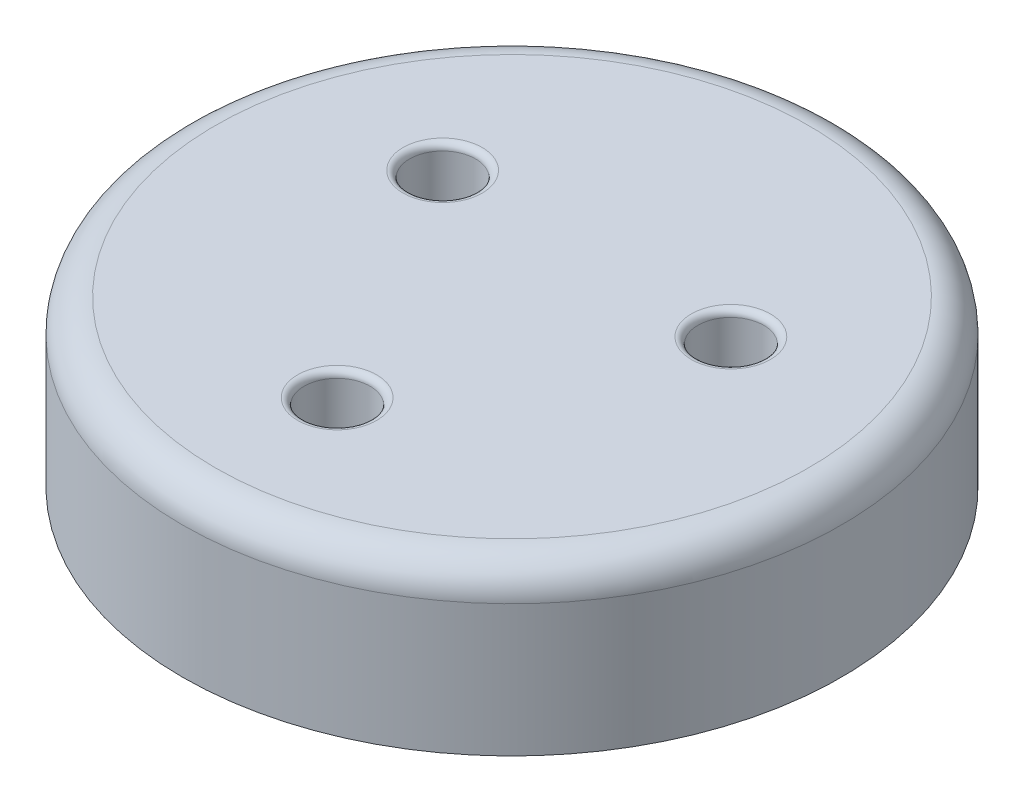
ISO-10303-21;
HEADER;
FILE_DESCRIPTION(('STEP AP214'),'2;1');
FILE_NAME('part.step','',(''),(''),'','','');
FILE_SCHEMA(('AUTOMOTIVE_DESIGN { 1 0 10303 214 1 1 1 1 }'));
ENDSEC;
DATA;
#1=APPLICATION_CONTEXT('core data for automotive mechanical design processes');
#2=APPLICATION_PROTOCOL_DEFINITION('international standard','automotive_design',2000,#1);
#3=PRODUCT_CONTEXT('',#1,'mechanical');
#4=PRODUCT('Part','Part','',(#3));
#5=PRODUCT_RELATED_PRODUCT_CATEGORY('part','',(#4));
#6=PRODUCT_DEFINITION_FORMATION('','',#4);
#7=PRODUCT_DEFINITION_CONTEXT('part definition',#1,'design');
#8=PRODUCT_DEFINITION('design','',#6,#7);
#9=PRODUCT_DEFINITION_SHAPE('','',#8);
#10=(LENGTH_UNIT() NAMED_UNIT(*) SI_UNIT(.MILLI.,.METRE.));
#11=(NAMED_UNIT(*) PLANE_ANGLE_UNIT() SI_UNIT($,.RADIAN.));
#12=(NAMED_UNIT(*) SI_UNIT($,.STERADIAN.) SOLID_ANGLE_UNIT());
#13=UNCERTAINTY_MEASURE_WITH_UNIT(LENGTH_MEASURE(1.E-05),#10,'distance_accuracy_value','');
#14=(GEOMETRIC_REPRESENTATION_CONTEXT(3) GLOBAL_UNCERTAINTY_ASSIGNED_CONTEXT((#13)) GLOBAL_UNIT_ASSIGNED_CONTEXT((#10,
#11,#12)) REPRESENTATION_CONTEXT('',''));
#15=CARTESIAN_POINT('',(0.,0.,0.));
#16=DIRECTION('',(0.,0.,1.));
#17=DIRECTION('',(1.,0.,0.));
#18=AXIS2_PLACEMENT_3D('',#15,#16,#17);
#19=CARTESIAN_POINT('',(0.,5.,0.));
#20=DIRECTION('',(0.,1.,0.));
#21=DIRECTION('',(0.,0.,1.));
#22=AXIS2_PLACEMENT_3D('',#19,#20,#21);
#23=PLANE('',#22);
#24=CARTESIAN_POINT('',(0.,5.,5.30591237991675));
#25=DIRECTION('',(0.,1.,0.));
#26=DIRECTION('',(0.,0.,1.));
#27=AXIS2_PLACEMENT_3D('',#24,#25,#26);
#28=CIRCLE('',#27,1.2);
#29=CARTESIAN_POINT('',(0.,5.,6.50591237991675));
#30=VERTEX_POINT('',#29);
#31=EDGE_CURVE('E45',#30,#30,#28,.F.);
#32=ORIENTED_EDGE('',*,*,#31,.T.);
#33=EDGE_LOOP('',(#32));
#34=FACE_BOUND('',#33,.T.);
#35=CARTESIAN_POINT('',(4.37293427579676,5.,-2.26823196392264));
#36=DIRECTION('',(0.,1.,0.));
#37=DIRECTION('',(0.,0.,1.));
#38=AXIS2_PLACEMENT_3D('',#35,#36,#37);
#39=CIRCLE('',#38,1.2);
#40=CARTESIAN_POINT('',(4.37293427579676,5.,-1.06823196392264));
#41=VERTEX_POINT('',#40);
#42=EDGE_CURVE('E49',#41,#41,#39,.F.);
#43=ORIENTED_EDGE('',*,*,#42,.T.);
#44=EDGE_LOOP('',(#43));
#45=FACE_BOUND('',#44,.T.);
#46=CARTESIAN_POINT('',(-4.37293427579676,5.,-2.26823196392264));
#47=DIRECTION('',(0.,1.,0.));
#48=DIRECTION('',(0.,0.,1.));
#49=AXIS2_PLACEMENT_3D('',#46,#47,#48);
#50=CIRCLE('',#49,1.2);
#51=CARTESIAN_POINT('',(-4.37293427579676,5.,-1.06823196392264));
#52=VERTEX_POINT('',#51);
#53=EDGE_CURVE('E54',#52,#52,#50,.F.);
#54=ORIENTED_EDGE('',*,*,#53,.T.);
#55=EDGE_LOOP('',(#54));
#56=FACE_BOUND('',#55,.T.);
#57=CARTESIAN_POINT('',(0.,5.,0.));
#58=DIRECTION('',(0.,1.,0.));
#59=DIRECTION('',(0.,0.,1.));
#60=AXIS2_PLACEMENT_3D('',#57,#58,#59);
#61=CIRCLE('',#60,9.);
#62=CARTESIAN_POINT('',(0.,5.,9.));
#63=VERTEX_POINT('',#62);
#64=EDGE_CURVE('E63',#63,#63,#61,.T.);
#65=ORIENTED_EDGE('',*,*,#64,.T.);
#66=EDGE_LOOP('',(#65));
#67=FACE_BOUND('',#66,.T.);
#68=ADVANCED_FACE('F34',(#34,#45,#56,#67),#23,.T.);
#69=CARTESIAN_POINT('',(0.,0.,0.));
#70=DIRECTION('',(0.,1.,0.));
#71=DIRECTION('',(0.,0.,1.));
#72=AXIS2_PLACEMENT_3D('',#69,#70,#71);
#73=PLANE('',#72);
#74=CARTESIAN_POINT('',(0.,0.,0.));
#75=DIRECTION('',(0.,1.,0.));
#76=DIRECTION('',(0.,0.,1.));
#77=AXIS2_PLACEMENT_3D('',#74,#75,#76);
#78=CIRCLE('',#77,10.);
#79=CARTESIAN_POINT('',(0.,0.,10.));
#80=VERTEX_POINT('',#79);
#81=EDGE_CURVE('E66',#80,#80,#78,.T.);
#82=ORIENTED_EDGE('',*,*,#81,.F.);
#83=EDGE_LOOP('',(#82));
#84=FACE_BOUND('',#83,.T.);
#85=CARTESIAN_POINT('',(4.37293427579676,0.,-2.26823196392264));
#86=DIRECTION('',(0.,1.,0.));
#87=DIRECTION('',(0.,0.,1.));
#88=AXIS2_PLACEMENT_3D('',#85,#86,#87);
#89=CIRCLE('',#88,1.);
#90=CARTESIAN_POINT('',(4.37293427579676,0.,-1.26823196392264));
#91=VERTEX_POINT('',#90);
#92=EDGE_CURVE('E69',#91,#91,#89,.T.);
#93=ORIENTED_EDGE('',*,*,#92,.T.);
#94=EDGE_LOOP('',(#93));
#95=FACE_BOUND('',#94,.T.);
#96=CARTESIAN_POINT('',(-4.37293427579676,0.,-2.26823196392264));
#97=DIRECTION('',(0.,1.,0.));
#98=DIRECTION('',(0.,0.,1.));
#99=AXIS2_PLACEMENT_3D('',#96,#97,#98);
#100=CIRCLE('',#99,1.);
#101=CARTESIAN_POINT('',(-4.37293427579676,0.,-1.26823196392264));
#102=VERTEX_POINT('',#101);
#103=EDGE_CURVE('E72',#102,#102,#100,.T.);
#104=ORIENTED_EDGE('',*,*,#103,.T.);
#105=EDGE_LOOP('',(#104));
#106=FACE_BOUND('',#105,.T.);
#107=CARTESIAN_POINT('',(0.,0.,5.30591237991675));
#108=DIRECTION('',(0.,1.,0.));
#109=DIRECTION('',(0.,0.,1.));
#110=AXIS2_PLACEMENT_3D('',#107,#108,#109);
#111=CIRCLE('',#110,1.);
#112=CARTESIAN_POINT('',(0.,0.,6.30591237991675));
#113=VERTEX_POINT('',#112);
#114=EDGE_CURVE('E75',#113,#113,#111,.T.);
#115=ORIENTED_EDGE('',*,*,#114,.T.);
#116=EDGE_LOOP('',(#115));
#117=FACE_BOUND('',#116,.T.);
#118=ADVANCED_FACE('F79',(#84,#95,#106,#117),#73,.F.);
#119=CARTESIAN_POINT('',(0.,5.,0.));
#120=DIRECTION('',(0.,-1.,0.));
#121=DIRECTION('',(0.,0.,-1.));
#122=AXIS2_PLACEMENT_3D('',#119,#120,#121);
#123=CYLINDRICAL_SURFACE('',#122,10.);
#124=CARTESIAN_POINT('',(0.,4.,0.));
#125=DIRECTION('',(0.,1.,0.));
#126=DIRECTION('',(0.,0.,1.));
#127=AXIS2_PLACEMENT_3D('',#124,#125,#126);
#128=CIRCLE('',#127,10.);
#129=CARTESIAN_POINT('',(0.,4.,10.));
#130=VERTEX_POINT('',#129);
#131=EDGE_CURVE('E60',#130,#130,#128,.F.);
#132=ORIENTED_EDGE('',*,*,#131,.T.);
#133=EDGE_LOOP('',(#132));
#134=FACE_BOUND('',#133,.T.);
#135=ORIENTED_EDGE('',*,*,#81,.T.);
#136=EDGE_LOOP('',(#135));
#137=FACE_BOUND('',#136,.T.);
#138=ADVANCED_FACE('F102',(#134,#137),#123,.T.);
#139=CARTESIAN_POINT('',(4.37293427579676,5.,-2.26823196392264));
#140=DIRECTION('',(0.,-1.,0.));
#141=DIRECTION('',(0.,0.,-1.));
#142=AXIS2_PLACEMENT_3D('',#139,#140,#141);
#143=CYLINDRICAL_SURFACE('',#142,1.);
#144=CARTESIAN_POINT('',(4.37293427579676,4.8,-2.26823196392264));
#145=DIRECTION('',(0.,1.,0.));
#146=DIRECTION('',(0.,0.,1.));
#147=AXIS2_PLACEMENT_3D('',#144,#145,#146);
#148=CIRCLE('',#147,1.);
#149=CARTESIAN_POINT('',(4.37293427579676,4.8,-1.26823196392264));
#150=VERTEX_POINT('',#149);
#151=EDGE_CURVE('E41',#150,#150,#148,.T.);
#152=ORIENTED_EDGE('',*,*,#151,.T.);
#153=EDGE_LOOP('',(#152));
#154=FACE_BOUND('',#153,.T.);
#155=ORIENTED_EDGE('',*,*,#92,.F.);
#156=EDGE_LOOP('',(#155));
#157=FACE_BOUND('',#156,.T.);
#158=ADVANCED_FACE('F94',(#154,#157),#143,.F.);
#159=CARTESIAN_POINT('',(-4.37293427579676,5.,-2.26823196392264));
#160=DIRECTION('',(0.,-1.,0.));
#161=DIRECTION('',(0.,0.,-1.));
#162=AXIS2_PLACEMENT_3D('',#159,#160,#161);
#163=CYLINDRICAL_SURFACE('',#162,1.);
#164=CARTESIAN_POINT('',(-4.37293427579676,4.8,-2.26823196392264));
#165=DIRECTION('',(0.,1.,0.));
#166=DIRECTION('',(0.,0.,1.));
#167=AXIS2_PLACEMENT_3D('',#164,#165,#166);
#168=CIRCLE('',#167,1.);
#169=CARTESIAN_POINT('',(-4.37293427579676,4.8,-1.26823196392264));
#170=VERTEX_POINT('',#169);
#171=EDGE_CURVE('E10',#170,#170,#168,.T.);
#172=ORIENTED_EDGE('',*,*,#171,.T.);
#173=EDGE_LOOP('',(#172));
#174=FACE_BOUND('',#173,.T.);
#175=ORIENTED_EDGE('',*,*,#103,.F.);
#176=EDGE_LOOP('',(#175));
#177=FACE_BOUND('',#176,.T.);
#178=ADVANCED_FACE('F84',(#174,#177),#163,.F.);
#179=CARTESIAN_POINT('',(0.,5.,5.30591237991675));
#180=DIRECTION('',(0.,-1.,0.));
#181=DIRECTION('',(0.,0.,-1.));
#182=AXIS2_PLACEMENT_3D('',#179,#180,#181);
#183=CYLINDRICAL_SURFACE('',#182,1.);
#184=CARTESIAN_POINT('',(0.,4.8,5.30591237991675));
#185=DIRECTION('',(0.,1.,0.));
#186=DIRECTION('',(0.,0.,1.));
#187=AXIS2_PLACEMENT_3D('',#184,#185,#186);
#188=CIRCLE('',#187,1.);
#189=CARTESIAN_POINT('',(0.,4.8,6.30591237991675));
#190=VERTEX_POINT('',#189);
#191=EDGE_CURVE('E57',#190,#190,#188,.T.);
#192=ORIENTED_EDGE('',*,*,#191,.T.);
#193=EDGE_LOOP('',(#192));
#194=FACE_BOUND('',#193,.T.);
#195=ORIENTED_EDGE('',*,*,#114,.F.);
#196=EDGE_LOOP('',(#195));
#197=FACE_BOUND('',#196,.T.);
#198=ADVANCED_FACE('F81',(#194,#197),#183,.F.);
#199=CARTESIAN_POINT('',(0.,4.,0.));
#200=DIRECTION('',(0.,1.,0.));
#201=DIRECTION('',(0.,0.,1.));
#202=AXIS2_PLACEMENT_3D('',#199,#200,#201);
#203=TOROIDAL_SURFACE('',#202,9.,1.);
#204=ORIENTED_EDGE('',*,*,#131,.F.);
#205=EDGE_LOOP('',(#204));
#206=FACE_BOUND('',#205,.T.);
#207=ORIENTED_EDGE('',*,*,#64,.F.);
#208=EDGE_LOOP('',(#207));
#209=FACE_BOUND('',#208,.T.);
#210=ADVANCED_FACE('F83',(#206,#209),#203,.T.);
#211=CARTESIAN_POINT('',(0.,4.8,5.30591237991675));
#212=DIRECTION('',(0.,1.,0.));
#213=DIRECTION('',(0.,0.,1.));
#214=AXIS2_PLACEMENT_3D('',#211,#212,#213);
#215=TOROIDAL_SURFACE('',#214,1.2,0.2);
#216=ORIENTED_EDGE('',*,*,#31,.F.);
#217=EDGE_LOOP('',(#216));
#218=FACE_BOUND('',#217,.T.);
#219=ORIENTED_EDGE('',*,*,#191,.F.);
#220=EDGE_LOOP('',(#219));
#221=FACE_BOUND('',#220,.T.);
#222=ADVANCED_FACE('F91',(#218,#221),#215,.T.);
#223=CARTESIAN_POINT('',(4.37293427579676,4.8,-2.26823196392264));
#224=DIRECTION('',(0.,1.,0.));
#225=DIRECTION('',(0.,0.,1.));
#226=AXIS2_PLACEMENT_3D('',#223,#224,#225);
#227=TOROIDAL_SURFACE('',#226,1.2,0.2);
#228=ORIENTED_EDGE('',*,*,#42,.F.);
#229=EDGE_LOOP('',(#228));
#230=FACE_BOUND('',#229,.T.);
#231=ORIENTED_EDGE('',*,*,#151,.F.);
#232=EDGE_LOOP('',(#231));
#233=FACE_BOUND('',#232,.T.);
#234=ADVANCED_FACE('F112',(#230,#233),#227,.T.);
#235=CARTESIAN_POINT('',(-4.37293427579676,4.8,-2.26823196392264));
#236=DIRECTION('',(0.,1.,0.));
#237=DIRECTION('',(0.,0.,1.));
#238=AXIS2_PLACEMENT_3D('',#235,#236,#237);
#239=TOROIDAL_SURFACE('',#238,1.2,0.2);
#240=ORIENTED_EDGE('',*,*,#53,.F.);
#241=EDGE_LOOP('',(#240));
#242=FACE_BOUND('',#241,.T.);
#243=ORIENTED_EDGE('',*,*,#171,.F.);
#244=EDGE_LOOP('',(#243));
#245=FACE_BOUND('',#244,.T.);
#246=ADVANCED_FACE('F36',(#242,#245),#239,.T.);
#247=CLOSED_SHELL('',(#68,#118,#138,#158,#178,#198,#210,#222,#234,#246));
#248=MANIFOLD_SOLID_BREP('B2',#247);
#249=ADVANCED_BREP_SHAPE_REPRESENTATION('',(#18,#248),#14);
#250=SHAPE_DEFINITION_REPRESENTATION(#9,#249);
ENDSEC;
END-ISO-10303-21;
